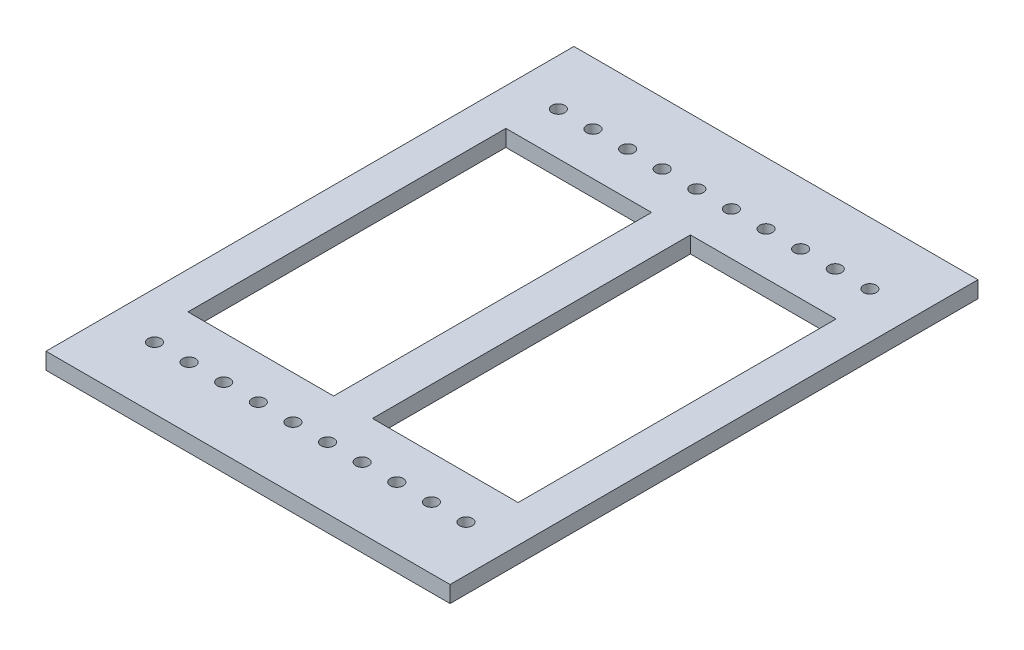
ISO-10303-21;
HEADER;
FILE_DESCRIPTION(('STEP AP214'),'2;1');
FILE_NAME('part.step','',(''),(''),'','','');
FILE_SCHEMA(('AUTOMOTIVE_DESIGN { 1 0 10303 214 1 1 1 1 }'));
ENDSEC;
DATA;
#1=APPLICATION_CONTEXT('core data for automotive mechanical design processes');
#2=APPLICATION_PROTOCOL_DEFINITION('international standard','automotive_design',2000,#1);
#3=PRODUCT_CONTEXT('',#1,'mechanical');
#4=PRODUCT('Part','Part','',(#3));
#5=PRODUCT_RELATED_PRODUCT_CATEGORY('part','',(#4));
#6=PRODUCT_DEFINITION_FORMATION('','',#4);
#7=PRODUCT_DEFINITION_CONTEXT('part definition',#1,'design');
#8=PRODUCT_DEFINITION('design','',#6,#7);
#9=PRODUCT_DEFINITION_SHAPE('','',#8);
#10=(LENGTH_UNIT() NAMED_UNIT(*) SI_UNIT(.MILLI.,.METRE.));
#11=(NAMED_UNIT(*) PLANE_ANGLE_UNIT() SI_UNIT($,.RADIAN.));
#12=(NAMED_UNIT(*) SI_UNIT($,.STERADIAN.) SOLID_ANGLE_UNIT());
#13=UNCERTAINTY_MEASURE_WITH_UNIT(LENGTH_MEASURE(1.E-05),#10,'distance_accuracy_value','');
#14=(GEOMETRIC_REPRESENTATION_CONTEXT(3) GLOBAL_UNCERTAINTY_ASSIGNED_CONTEXT((#13)) GLOBAL_UNIT_ASSIGNED_CONTEXT((#10,
#11,#12)) REPRESENTATION_CONTEXT('',''));
#15=CARTESIAN_POINT('',(0.,0.,0.));
#16=DIRECTION('',(0.,0.,1.));
#17=DIRECTION('',(1.,0.,0.));
#18=AXIS2_PLACEMENT_3D('',#15,#16,#17);
#19=CARTESIAN_POINT('',(0.,0.85,0.));
#20=DIRECTION('',(0.,-1.,0.));
#21=DIRECTION('',(0.,0.,-1.));
#22=AXIS2_PLACEMENT_3D('',#19,#20,#21);
#23=PLANE('',#22);
#24=DIRECTION('',(0.,0.,1.));
#25=VECTOR('',#24,1.);
#26=CARTESIAN_POINT('',(1.9,0.85,-21.75));
#27=LINE('',#26,#25);
#28=CARTESIAN_POINT('',(1.9,0.85,-21.75));
#29=VERTEX_POINT('',#28);
#30=CARTESIAN_POINT('',(1.9,0.85,-5.4));
#31=VERTEX_POINT('',#30);
#32=EDGE_CURVE('E167',#29,#31,#27,.T.);
#33=ORIENTED_EDGE('',*,*,#32,.F.);
#34=DIRECTION('',(-1.,0.,0.));
#35=VECTOR('',#34,1.);
#36=CARTESIAN_POINT('',(1.9,0.85,-21.75));
#37=LINE('',#36,#35);
#38=CARTESIAN_POINT('',(9.39,0.85,-21.75));
#39=VERTEX_POINT('',#38);
#40=EDGE_CURVE('E175',#39,#29,#37,.T.);
#41=ORIENTED_EDGE('',*,*,#40,.F.);
#42=DIRECTION('',(0.,0.,-1.));
#43=VECTOR('',#42,1.);
#44=CARTESIAN_POINT('',(9.39,0.85,-21.75));
#45=LINE('',#44,#43);
#46=CARTESIAN_POINT('',(9.39,0.85,-5.4));
#47=VERTEX_POINT('',#46);
#48=EDGE_CURVE('E172',#47,#39,#45,.T.);
#49=ORIENTED_EDGE('',*,*,#48,.F.);
#50=DIRECTION('',(1.,0.,0.));
#51=VECTOR('',#50,1.);
#52=CARTESIAN_POINT('',(1.9,0.85,-5.4));
#53=LINE('',#52,#51);
#54=EDGE_CURVE('E169',#31,#47,#53,.T.);
#55=ORIENTED_EDGE('',*,*,#54,.F.);
#56=EDGE_LOOP('',(#33,#41,#49,#55));
#57=FACE_BOUND('',#56,.T.);
#58=DIRECTION('',(0.,0.,1.));
#59=VECTOR('',#58,1.);
#60=CARTESIAN_POINT('',(0.,0.85,0.));
#61=LINE('',#60,#59);
#62=CARTESIAN_POINT('',(0.,0.85,-27.15));
#63=VERTEX_POINT('',#62);
#64=CARTESIAN_POINT('',(0.,0.85,0.));
#65=VERTEX_POINT('',#64);
#66=EDGE_CURVE('E198',#63,#65,#61,.T.);
#67=ORIENTED_EDGE('',*,*,#66,.T.);
#68=DIRECTION('',(1.,0.,0.));
#69=VECTOR('',#68,1.);
#70=CARTESIAN_POINT('',(0.,0.85,0.));
#71=LINE('',#70,#69);
#72=CARTESIAN_POINT('',(20.78,0.85,0.));
#73=VERTEX_POINT('',#72);
#74=EDGE_CURVE('E201',#65,#73,#71,.T.);
#75=ORIENTED_EDGE('',*,*,#74,.T.);
#76=DIRECTION('',(0.,0.,-1.));
#77=VECTOR('',#76,1.);
#78=CARTESIAN_POINT('',(20.78,0.85,0.));
#79=LINE('',#78,#77);
#80=CARTESIAN_POINT('',(20.78,0.85,-27.15));
#81=VERTEX_POINT('',#80);
#82=EDGE_CURVE('E204',#73,#81,#79,.T.);
#83=ORIENTED_EDGE('',*,*,#82,.T.);
#84=DIRECTION('',(-1.,0.,0.));
#85=VECTOR('',#84,1.);
#86=CARTESIAN_POINT('',(0.,0.85,-27.15));
#87=LINE('',#86,#85);
#88=EDGE_CURVE('E206',#81,#63,#87,.T.);
#89=ORIENTED_EDGE('',*,*,#88,.T.);
#90=EDGE_LOOP('',(#67,#75,#83,#89));
#91=FACE_BOUND('',#90,.T.);
#92=DIRECTION('',(0.,0.,-1.));
#93=VECTOR('',#92,1.);
#94=CARTESIAN_POINT('',(18.88,0.85,-21.75));
#95=LINE('',#94,#93);
#96=CARTESIAN_POINT('',(18.88,0.85,-5.40000000000001));
#97=VERTEX_POINT('',#96);
#98=CARTESIAN_POINT('',(18.88,0.85,-21.75));
#99=VERTEX_POINT('',#98);
#100=EDGE_CURVE('E128',#97,#99,#95,.T.);
#101=ORIENTED_EDGE('',*,*,#100,.F.);
#102=DIRECTION('',(1.,0.,0.));
#103=VECTOR('',#102,1.);
#104=CARTESIAN_POINT('',(18.88,0.85,-5.40000000000001));
#105=LINE('',#104,#103);
#106=CARTESIAN_POINT('',(11.39,0.85,-5.40000000000001));
#107=VERTEX_POINT('',#106);
#108=EDGE_CURVE('E151',#107,#97,#105,.T.);
#109=ORIENTED_EDGE('',*,*,#108,.F.);
#110=DIRECTION('',(0.,0.,1.));
#111=VECTOR('',#110,1.);
#112=CARTESIAN_POINT('',(11.39,0.85,-21.75));
#113=LINE('',#112,#111);
#114=CARTESIAN_POINT('',(11.39,0.85,-21.75));
#115=VERTEX_POINT('',#114);
#116=EDGE_CURVE('E149',#115,#107,#113,.T.);
#117=ORIENTED_EDGE('',*,*,#116,.F.);
#118=DIRECTION('',(-1.,0.,0.));
#119=VECTOR('',#118,1.);
#120=CARTESIAN_POINT('',(18.88,0.85,-21.75));
#121=LINE('',#120,#119);
#122=EDGE_CURVE('E136',#99,#115,#121,.T.);
#123=ORIENTED_EDGE('',*,*,#122,.F.);
#124=EDGE_LOOP('',(#101,#109,#117,#123));
#125=FACE_BOUND('',#124,.T.);
#126=CARTESIAN_POINT('',(2.389,0.85,-23.96));
#127=DIRECTION('',(0.,1.,0.));
#128=DIRECTION('',(0.,0.,1.));
#129=AXIS2_PLACEMENT_3D('',#126,#127,#128);
#130=CIRCLE('',#129,0.33);
#131=CARTESIAN_POINT('',(2.389,0.85,-23.63));
#132=VERTEX_POINT('',#131);
#133=EDGE_CURVE('E157',#132,#132,#130,.T.);
#134=ORIENTED_EDGE('',*,*,#133,.F.);
#135=EDGE_LOOP('',(#134));
#136=FACE_BOUND('',#135,.T.);
#137=CARTESIAN_POINT('',(18.409,0.85,-3.19));
#138=DIRECTION('',(0.,1.,0.));
#139=DIRECTION('',(0.,0.,-1.));
#140=AXIS2_PLACEMENT_3D('',#137,#138,#139);
#141=CIRCLE('',#140,0.330000000000007);
#142=CARTESIAN_POINT('',(18.409,0.85,-3.52));
#143=VERTEX_POINT('',#142);
#144=EDGE_CURVE('E497',#143,#143,#141,.T.);
#145=ORIENTED_EDGE('',*,*,#144,.F.);
#146=EDGE_LOOP('',(#145));
#147=FACE_BOUND('',#146,.T.);
#148=CARTESIAN_POINT('',(4.169,0.85,-23.96));
#149=DIRECTION('',(0.,1.,0.));
#150=DIRECTION('',(0.,0.,1.));
#151=AXIS2_PLACEMENT_3D('',#148,#149,#150);
#152=CIRCLE('',#151,0.33);
#153=CARTESIAN_POINT('',(4.169,0.85,-23.63));
#154=VERTEX_POINT('',#153);
#155=EDGE_CURVE('E491',#154,#154,#152,.T.);
#156=ORIENTED_EDGE('',*,*,#155,.F.);
#157=EDGE_LOOP('',(#156));
#158=FACE_BOUND('',#157,.T.);
#159=CARTESIAN_POINT('',(5.949,0.85,-23.96));
#160=DIRECTION('',(0.,1.,0.));
#161=DIRECTION('',(0.,0.,1.));
#162=AXIS2_PLACEMENT_3D('',#159,#160,#161);
#163=CIRCLE('',#162,0.33);
#164=CARTESIAN_POINT('',(5.949,0.85,-23.63));
#165=VERTEX_POINT('',#164);
#166=EDGE_CURVE('E485',#165,#165,#163,.T.);
#167=ORIENTED_EDGE('',*,*,#166,.F.);
#168=EDGE_LOOP('',(#167));
#169=FACE_BOUND('',#168,.T.);
#170=CARTESIAN_POINT('',(7.729,0.85,-23.96));
#171=DIRECTION('',(0.,1.,0.));
#172=DIRECTION('',(0.,0.,1.));
#173=AXIS2_PLACEMENT_3D('',#170,#171,#172);
#174=CIRCLE('',#173,0.33);
#175=CARTESIAN_POINT('',(7.729,0.85,-23.63));
#176=VERTEX_POINT('',#175);
#177=EDGE_CURVE('E479',#176,#176,#174,.T.);
#178=ORIENTED_EDGE('',*,*,#177,.F.);
#179=EDGE_LOOP('',(#178));
#180=FACE_BOUND('',#179,.T.);
#181=CARTESIAN_POINT('',(9.509,0.85,-23.96));
#182=DIRECTION('',(0.,1.,0.));
#183=DIRECTION('',(0.,0.,1.));
#184=AXIS2_PLACEMENT_3D('',#181,#182,#183);
#185=CIRCLE('',#184,0.33);
#186=CARTESIAN_POINT('',(9.509,0.85,-23.63));
#187=VERTEX_POINT('',#186);
#188=EDGE_CURVE('E473',#187,#187,#185,.T.);
#189=ORIENTED_EDGE('',*,*,#188,.F.);
#190=EDGE_LOOP('',(#189));
#191=FACE_BOUND('',#190,.T.);
#192=CARTESIAN_POINT('',(11.289,0.85,-23.96));
#193=DIRECTION('',(0.,1.,0.));
#194=DIRECTION('',(0.,0.,1.));
#195=AXIS2_PLACEMENT_3D('',#192,#193,#194);
#196=CIRCLE('',#195,0.329999999999999);
#197=CARTESIAN_POINT('',(11.289,0.85,-23.63));
#198=VERTEX_POINT('',#197);
#199=EDGE_CURVE('E467',#198,#198,#196,.T.);
#200=ORIENTED_EDGE('',*,*,#199,.F.);
#201=EDGE_LOOP('',(#200));
#202=FACE_BOUND('',#201,.T.);
#203=CARTESIAN_POINT('',(13.069,0.85,-23.96));
#204=DIRECTION('',(0.,1.,0.));
#205=DIRECTION('',(0.,0.,1.));
#206=AXIS2_PLACEMENT_3D('',#203,#204,#205);
#207=CIRCLE('',#206,0.329999999999999);
#208=CARTESIAN_POINT('',(13.069,0.85,-23.63));
#209=VERTEX_POINT('',#208);
#210=EDGE_CURVE('E461',#209,#209,#207,.T.);
#211=ORIENTED_EDGE('',*,*,#210,.F.);
#212=EDGE_LOOP('',(#211));
#213=FACE_BOUND('',#212,.T.);
#214=CARTESIAN_POINT('',(14.849,0.85,-23.96));
#215=DIRECTION('',(0.,1.,0.));
#216=DIRECTION('',(0.,0.,1.));
#217=AXIS2_PLACEMENT_3D('',#214,#215,#216);
#218=CIRCLE('',#217,0.329999999999999);
#219=CARTESIAN_POINT('',(14.849,0.85,-23.63));
#220=VERTEX_POINT('',#219);
#221=EDGE_CURVE('E455',#220,#220,#218,.T.);
#222=ORIENTED_EDGE('',*,*,#221,.F.);
#223=EDGE_LOOP('',(#222));
#224=FACE_BOUND('',#223,.T.);
#225=CARTESIAN_POINT('',(16.629,0.85,-23.96));
#226=DIRECTION('',(0.,1.,0.));
#227=DIRECTION('',(0.,0.,1.));
#228=AXIS2_PLACEMENT_3D('',#225,#226,#227);
#229=CIRCLE('',#228,0.33);
#230=CARTESIAN_POINT('',(16.629,0.85,-23.63));
#231=VERTEX_POINT('',#230);
#232=EDGE_CURVE('E449',#231,#231,#229,.T.);
#233=ORIENTED_EDGE('',*,*,#232,.F.);
#234=EDGE_LOOP('',(#233));
#235=FACE_BOUND('',#234,.T.);
#236=CARTESIAN_POINT('',(18.409,0.85,-23.96));
#237=DIRECTION('',(0.,1.,0.));
#238=DIRECTION('',(0.,0.,1.));
#239=AXIS2_PLACEMENT_3D('',#236,#237,#238);
#240=CIRCLE('',#239,0.33);
#241=CARTESIAN_POINT('',(18.409,0.85,-23.63));
#242=VERTEX_POINT('',#241);
#243=EDGE_CURVE('E443',#242,#242,#240,.T.);
#244=ORIENTED_EDGE('',*,*,#243,.F.);
#245=EDGE_LOOP('',(#244));
#246=FACE_BOUND('',#245,.T.);
#247=CARTESIAN_POINT('',(16.629,0.85,-3.19));
#248=DIRECTION('',(0.,1.,0.));
#249=DIRECTION('',(0.,0.,-1.));
#250=AXIS2_PLACEMENT_3D('',#247,#248,#249);
#251=CIRCLE('',#250,0.330000000000007);
#252=CARTESIAN_POINT('',(16.629,0.85,-3.52));
#253=VERTEX_POINT('',#252);
#254=EDGE_CURVE('E437',#253,#253,#251,.T.);
#255=ORIENTED_EDGE('',*,*,#254,.F.);
#256=EDGE_LOOP('',(#255));
#257=FACE_BOUND('',#256,.T.);
#258=CARTESIAN_POINT('',(14.849,0.85,-3.18999999999999));
#259=DIRECTION('',(0.,1.,0.));
#260=DIRECTION('',(0.,0.,-1.));
#261=AXIS2_PLACEMENT_3D('',#258,#259,#260);
#262=CIRCLE('',#261,0.329999999999999);
#263=CARTESIAN_POINT('',(14.849,0.85,-3.51999999999999));
#264=VERTEX_POINT('',#263);
#265=EDGE_CURVE('E431',#264,#264,#262,.T.);
#266=ORIENTED_EDGE('',*,*,#265,.F.);
#267=EDGE_LOOP('',(#266));
#268=FACE_BOUND('',#267,.T.);
#269=CARTESIAN_POINT('',(13.069,0.85,-3.18999999999999));
#270=DIRECTION('',(0.,1.,0.));
#271=DIRECTION('',(0.,0.,-1.));
#272=AXIS2_PLACEMENT_3D('',#269,#270,#271);
#273=CIRCLE('',#272,0.329999999999999);
#274=CARTESIAN_POINT('',(13.069,0.85,-3.51999999999999));
#275=VERTEX_POINT('',#274);
#276=EDGE_CURVE('E425',#275,#275,#273,.T.);
#277=ORIENTED_EDGE('',*,*,#276,.F.);
#278=EDGE_LOOP('',(#277));
#279=FACE_BOUND('',#278,.T.);
#280=CARTESIAN_POINT('',(11.289,0.85,-3.18999999999999));
#281=DIRECTION('',(0.,1.,0.));
#282=DIRECTION('',(0.,0.,-1.));
#283=AXIS2_PLACEMENT_3D('',#280,#281,#282);
#284=CIRCLE('',#283,0.329999999999999);
#285=CARTESIAN_POINT('',(11.289,0.85,-3.51999999999999));
#286=VERTEX_POINT('',#285);
#287=EDGE_CURVE('E419',#286,#286,#284,.T.);
#288=ORIENTED_EDGE('',*,*,#287,.F.);
#289=EDGE_LOOP('',(#288));
#290=FACE_BOUND('',#289,.T.);
#291=CARTESIAN_POINT('',(9.509,0.85,-3.18999999999999));
#292=DIRECTION('',(0.,1.,0.));
#293=DIRECTION('',(0.,0.,-1.));
#294=AXIS2_PLACEMENT_3D('',#291,#292,#293);
#295=CIRCLE('',#294,0.33);
#296=CARTESIAN_POINT('',(9.509,0.85,-3.51999999999999));
#297=VERTEX_POINT('',#296);
#298=EDGE_CURVE('E413',#297,#297,#295,.T.);
#299=ORIENTED_EDGE('',*,*,#298,.F.);
#300=EDGE_LOOP('',(#299));
#301=FACE_BOUND('',#300,.T.);
#302=CARTESIAN_POINT('',(7.729,0.85,-3.18999999999999));
#303=DIRECTION('',(0.,1.,0.));
#304=DIRECTION('',(0.,0.,-1.));
#305=AXIS2_PLACEMENT_3D('',#302,#303,#304);
#306=CIRCLE('',#305,0.33);
#307=CARTESIAN_POINT('',(7.729,0.85,-3.51999999999999));
#308=VERTEX_POINT('',#307);
#309=EDGE_CURVE('E407',#308,#308,#306,.T.);
#310=ORIENTED_EDGE('',*,*,#309,.F.);
#311=EDGE_LOOP('',(#310));
#312=FACE_BOUND('',#311,.T.);
#313=CARTESIAN_POINT('',(5.949,0.85,-3.18999999999999));
#314=DIRECTION('',(0.,1.,0.));
#315=DIRECTION('',(0.,0.,-1.));
#316=AXIS2_PLACEMENT_3D('',#313,#314,#315);
#317=CIRCLE('',#316,0.33);
#318=CARTESIAN_POINT('',(5.949,0.85,-3.51999999999999));
#319=VERTEX_POINT('',#318);
#320=EDGE_CURVE('E401',#319,#319,#317,.T.);
#321=ORIENTED_EDGE('',*,*,#320,.F.);
#322=EDGE_LOOP('',(#321));
#323=FACE_BOUND('',#322,.T.);
#324=CARTESIAN_POINT('',(4.169,0.85,-3.18999999999999));
#325=DIRECTION('',(0.,1.,0.));
#326=DIRECTION('',(0.,0.,-1.));
#327=AXIS2_PLACEMENT_3D('',#324,#325,#326);
#328=CIRCLE('',#327,0.33);
#329=CARTESIAN_POINT('',(4.169,0.85,-3.51999999999999));
#330=VERTEX_POINT('',#329);
#331=EDGE_CURVE('E395',#330,#330,#328,.T.);
#332=ORIENTED_EDGE('',*,*,#331,.F.);
#333=EDGE_LOOP('',(#332));
#334=FACE_BOUND('',#333,.T.);
#335=CARTESIAN_POINT('',(2.389,0.85,-3.18999999999999));
#336=DIRECTION('',(0.,1.,0.));
#337=DIRECTION('',(0.,0.,-1.));
#338=AXIS2_PLACEMENT_3D('',#335,#336,#337);
#339=CIRCLE('',#338,0.33);
#340=CARTESIAN_POINT('',(2.389,0.85,-3.51999999999999));
#341=VERTEX_POINT('',#340);
#342=EDGE_CURVE('E386',#341,#341,#339,.T.);
#343=ORIENTED_EDGE('',*,*,#342,.F.);
#344=EDGE_LOOP('',(#343));
#345=FACE_BOUND('',#344,.T.);
#346=ADVANCED_FACE('F39',(#57,#91,#125,#136,#147,#158,#169,#180,#191,#202,#213,#224,#235,#246,
#257,#268,#279,#290,#301,#312,#323,#334,#345),#23,.F.);
#347=CARTESIAN_POINT('',(0.,0.,0.));
#348=DIRECTION('',(0.,-1.,0.));
#349=DIRECTION('',(0.,0.,-1.));
#350=AXIS2_PLACEMENT_3D('',#347,#348,#349);
#351=PLANE('',#350);
#352=CARTESIAN_POINT('',(4.169,0.,-3.18999999999999));
#353=DIRECTION('',(0.,1.,0.));
#354=DIRECTION('',(0.,0.,-1.));
#355=AXIS2_PLACEMENT_3D('',#352,#353,#354);
#356=CIRCLE('',#355,0.33);
#357=CARTESIAN_POINT('',(4.169,0.,-3.51999999999999));
#358=VERTEX_POINT('',#357);
#359=EDGE_CURVE('E392',#358,#358,#356,.T.);
#360=ORIENTED_EDGE('',*,*,#359,.T.);
#361=EDGE_LOOP('',(#360));
#362=FACE_BOUND('',#361,.T.);
#363=CARTESIAN_POINT('',(7.729,0.,-3.18999999999999));
#364=DIRECTION('',(0.,1.,0.));
#365=DIRECTION('',(0.,0.,-1.));
#366=AXIS2_PLACEMENT_3D('',#363,#364,#365);
#367=CIRCLE('',#366,0.33);
#368=CARTESIAN_POINT('',(7.729,0.,-3.51999999999999));
#369=VERTEX_POINT('',#368);
#370=EDGE_CURVE('E404',#369,#369,#367,.T.);
#371=ORIENTED_EDGE('',*,*,#370,.T.);
#372=EDGE_LOOP('',(#371));
#373=FACE_BOUND('',#372,.T.);
#374=CARTESIAN_POINT('',(11.289,0.,-3.18999999999999));
#375=DIRECTION('',(0.,1.,0.));
#376=DIRECTION('',(0.,0.,-1.));
#377=AXIS2_PLACEMENT_3D('',#374,#375,#376);
#378=CIRCLE('',#377,0.329999999999999);
#379=CARTESIAN_POINT('',(11.289,0.,-3.51999999999999));
#380=VERTEX_POINT('',#379);
#381=EDGE_CURVE('E416',#380,#380,#378,.T.);
#382=ORIENTED_EDGE('',*,*,#381,.T.);
#383=EDGE_LOOP('',(#382));
#384=FACE_BOUND('',#383,.T.);
#385=CARTESIAN_POINT('',(14.849,0.,-3.18999999999999));
#386=DIRECTION('',(0.,1.,0.));
#387=DIRECTION('',(0.,0.,-1.));
#388=AXIS2_PLACEMENT_3D('',#385,#386,#387);
#389=CIRCLE('',#388,0.329999999999999);
#390=CARTESIAN_POINT('',(14.849,0.,-3.51999999999999));
#391=VERTEX_POINT('',#390);
#392=EDGE_CURVE('E428',#391,#391,#389,.T.);
#393=ORIENTED_EDGE('',*,*,#392,.T.);
#394=EDGE_LOOP('',(#393));
#395=FACE_BOUND('',#394,.T.);
#396=CARTESIAN_POINT('',(18.409,0.,-23.96));
#397=DIRECTION('',(0.,1.,0.));
#398=DIRECTION('',(0.,0.,1.));
#399=AXIS2_PLACEMENT_3D('',#396,#397,#398);
#400=CIRCLE('',#399,0.33);
#401=CARTESIAN_POINT('',(18.409,0.,-23.63));
#402=VERTEX_POINT('',#401);
#403=EDGE_CURVE('E440',#402,#402,#400,.T.);
#404=ORIENTED_EDGE('',*,*,#403,.T.);
#405=EDGE_LOOP('',(#404));
#406=FACE_BOUND('',#405,.T.);
#407=CARTESIAN_POINT('',(14.849,0.,-23.96));
#408=DIRECTION('',(0.,1.,0.));
#409=DIRECTION('',(0.,0.,1.));
#410=AXIS2_PLACEMENT_3D('',#407,#408,#409);
#411=CIRCLE('',#410,0.329999999999999);
#412=CARTESIAN_POINT('',(14.849,0.,-23.63));
#413=VERTEX_POINT('',#412);
#414=EDGE_CURVE('E452',#413,#413,#411,.T.);
#415=ORIENTED_EDGE('',*,*,#414,.T.);
#416=EDGE_LOOP('',(#415));
#417=FACE_BOUND('',#416,.T.);
#418=CARTESIAN_POINT('',(11.289,0.,-23.96));
#419=DIRECTION('',(0.,1.,0.));
#420=DIRECTION('',(0.,0.,1.));
#421=AXIS2_PLACEMENT_3D('',#418,#419,#420);
#422=CIRCLE('',#421,0.329999999999999);
#423=CARTESIAN_POINT('',(11.289,0.,-23.63));
#424=VERTEX_POINT('',#423);
#425=EDGE_CURVE('E464',#424,#424,#422,.T.);
#426=ORIENTED_EDGE('',*,*,#425,.T.);
#427=EDGE_LOOP('',(#426));
#428=FACE_BOUND('',#427,.T.);
#429=CARTESIAN_POINT('',(7.729,0.,-23.96));
#430=DIRECTION('',(0.,1.,0.));
#431=DIRECTION('',(0.,0.,1.));
#432=AXIS2_PLACEMENT_3D('',#429,#430,#431);
#433=CIRCLE('',#432,0.33);
#434=CARTESIAN_POINT('',(7.729,0.,-23.63));
#435=VERTEX_POINT('',#434);
#436=EDGE_CURVE('E476',#435,#435,#433,.T.);
#437=ORIENTED_EDGE('',*,*,#436,.T.);
#438=EDGE_LOOP('',(#437));
#439=FACE_BOUND('',#438,.T.);
#440=CARTESIAN_POINT('',(4.169,0.,-23.96));
#441=DIRECTION('',(0.,1.,0.));
#442=DIRECTION('',(0.,0.,1.));
#443=AXIS2_PLACEMENT_3D('',#440,#441,#442);
#444=CIRCLE('',#443,0.33);
#445=CARTESIAN_POINT('',(4.169,0.,-23.63));
#446=VERTEX_POINT('',#445);
#447=EDGE_CURVE('E488',#446,#446,#444,.T.);
#448=ORIENTED_EDGE('',*,*,#447,.T.);
#449=EDGE_LOOP('',(#448));
#450=FACE_BOUND('',#449,.T.);
#451=CARTESIAN_POINT('',(2.389,0.,-23.96));
#452=DIRECTION('',(0.,1.,0.));
#453=DIRECTION('',(0.,0.,1.));
#454=AXIS2_PLACEMENT_3D('',#451,#452,#453);
#455=CIRCLE('',#454,0.33);
#456=CARTESIAN_POINT('',(2.389,0.,-23.63));
#457=VERTEX_POINT('',#456);
#458=EDGE_CURVE('E500',#457,#457,#455,.T.);
#459=ORIENTED_EDGE('',*,*,#458,.T.);
#460=EDGE_LOOP('',(#459));
#461=FACE_BOUND('',#460,.T.);
#462=DIRECTION('',(0.,0.,1.));
#463=VECTOR('',#462,1.);
#464=CARTESIAN_POINT('',(0.,0.,0.));
#465=LINE('',#464,#463);
#466=CARTESIAN_POINT('',(0.,0.,-27.15));
#467=VERTEX_POINT('',#466);
#468=CARTESIAN_POINT('',(0.,0.,0.));
#469=VERTEX_POINT('',#468);
#470=EDGE_CURVE('E197',#467,#469,#465,.T.);
#471=ORIENTED_EDGE('',*,*,#470,.F.);
#472=DIRECTION('',(-1.,0.,0.));
#473=VECTOR('',#472,1.);
#474=CARTESIAN_POINT('',(0.,0.,-27.15));
#475=LINE('',#474,#473);
#476=CARTESIAN_POINT('',(20.78,0.,-27.15));
#477=VERTEX_POINT('',#476);
#478=EDGE_CURVE('E202',#477,#467,#475,.T.);
#479=ORIENTED_EDGE('',*,*,#478,.F.);
#480=DIRECTION('',(0.,0.,-1.));
#481=VECTOR('',#480,1.);
#482=CARTESIAN_POINT('',(20.78,0.,0.));
#483=LINE('',#482,#481);
#484=CARTESIAN_POINT('',(20.78,0.,0.));
#485=VERTEX_POINT('',#484);
#486=EDGE_CURVE('E213',#485,#477,#483,.T.);
#487=ORIENTED_EDGE('',*,*,#486,.F.);
#488=DIRECTION('',(1.,0.,0.));
#489=VECTOR('',#488,1.);
#490=CARTESIAN_POINT('',(0.,0.,0.));
#491=LINE('',#490,#489);
#492=EDGE_CURVE('E211',#469,#485,#491,.T.);
#493=ORIENTED_EDGE('',*,*,#492,.F.);
#494=EDGE_LOOP('',(#471,#479,#487,#493));
#495=FACE_BOUND('',#494,.T.);
#496=DIRECTION('',(-1.,0.,0.));
#497=VECTOR('',#496,1.);
#498=CARTESIAN_POINT('',(1.9,0.,-21.75));
#499=LINE('',#498,#497);
#500=CARTESIAN_POINT('',(9.39,0.,-21.75));
#501=VERTEX_POINT('',#500);
#502=CARTESIAN_POINT('',(1.9,0.,-21.75));
#503=VERTEX_POINT('',#502);
#504=EDGE_CURVE('E170',#501,#503,#499,.T.);
#505=ORIENTED_EDGE('',*,*,#504,.T.);
#506=DIRECTION('',(0.,0.,1.));
#507=VECTOR('',#506,1.);
#508=CARTESIAN_POINT('',(1.9,0.,-21.75));
#509=LINE('',#508,#507);
#510=CARTESIAN_POINT('',(1.9,0.,-5.4));
#511=VERTEX_POINT('',#510);
#512=EDGE_CURVE('E144',#503,#511,#509,.T.);
#513=ORIENTED_EDGE('',*,*,#512,.T.);
#514=DIRECTION('',(1.,0.,0.));
#515=VECTOR('',#514,1.);
#516=CARTESIAN_POINT('',(1.9,0.,-5.4));
#517=LINE('',#516,#515);
#518=CARTESIAN_POINT('',(9.39,0.,-5.4));
#519=VERTEX_POINT('',#518);
#520=EDGE_CURVE('E180',#511,#519,#517,.T.);
#521=ORIENTED_EDGE('',*,*,#520,.T.);
#522=DIRECTION('',(0.,0.,-1.));
#523=VECTOR('',#522,1.);
#524=CARTESIAN_POINT('',(9.39,0.,-21.75));
#525=LINE('',#524,#523);
#526=EDGE_CURVE('E183',#519,#501,#525,.T.);
#527=ORIENTED_EDGE('',*,*,#526,.T.);
#528=EDGE_LOOP('',(#505,#513,#521,#527));
#529=FACE_BOUND('',#528,.T.);
#530=DIRECTION('',(1.,0.,0.));
#531=VECTOR('',#530,1.);
#532=CARTESIAN_POINT('',(18.88,0.,-5.40000000000001));
#533=LINE('',#532,#531);
#534=CARTESIAN_POINT('',(11.39,0.,-5.40000000000001));
#535=VERTEX_POINT('',#534);
#536=CARTESIAN_POINT('',(18.88,0.,-5.40000000000001));
#537=VERTEX_POINT('',#536);
#538=EDGE_CURVE('E137',#535,#537,#533,.T.);
#539=ORIENTED_EDGE('',*,*,#538,.T.);
#540=DIRECTION('',(0.,0.,-1.));
#541=VECTOR('',#540,1.);
#542=CARTESIAN_POINT('',(18.88,0.,-21.75));
#543=LINE('',#542,#541);
#544=CARTESIAN_POINT('',(18.88,0.,-21.75));
#545=VERTEX_POINT('',#544);
#546=EDGE_CURVE('E62',#537,#545,#543,.T.);
#547=ORIENTED_EDGE('',*,*,#546,.T.);
#548=DIRECTION('',(-1.,0.,0.));
#549=VECTOR('',#548,1.);
#550=CARTESIAN_POINT('',(18.88,0.,-21.75));
#551=LINE('',#550,#549);
#552=CARTESIAN_POINT('',(11.39,0.,-21.75));
#553=VERTEX_POINT('',#552);
#554=EDGE_CURVE('E143',#545,#553,#551,.T.);
#555=ORIENTED_EDGE('',*,*,#554,.T.);
#556=DIRECTION('',(0.,0.,1.));
#557=VECTOR('',#556,1.);
#558=CARTESIAN_POINT('',(11.39,0.,-21.75));
#559=LINE('',#558,#557);
#560=EDGE_CURVE('E159',#553,#535,#559,.T.);
#561=ORIENTED_EDGE('',*,*,#560,.T.);
#562=EDGE_LOOP('',(#539,#547,#555,#561));
#563=FACE_BOUND('',#562,.T.);
#564=CARTESIAN_POINT('',(18.409,0.,-3.19));
#565=DIRECTION('',(0.,1.,0.));
#566=DIRECTION('',(0.,0.,-1.));
#567=AXIS2_PLACEMENT_3D('',#564,#565,#566);
#568=CIRCLE('',#567,0.330000000000007);
#569=CARTESIAN_POINT('',(18.409,0.,-3.52));
#570=VERTEX_POINT('',#569);
#571=EDGE_CURVE('E494',#570,#570,#568,.T.);
#572=ORIENTED_EDGE('',*,*,#571,.T.);
#573=EDGE_LOOP('',(#572));
#574=FACE_BOUND('',#573,.T.);
#575=CARTESIAN_POINT('',(5.949,0.,-23.96));
#576=DIRECTION('',(0.,1.,0.));
#577=DIRECTION('',(0.,0.,1.));
#578=AXIS2_PLACEMENT_3D('',#575,#576,#577);
#579=CIRCLE('',#578,0.33);
#580=CARTESIAN_POINT('',(5.949,0.,-23.63));
#581=VERTEX_POINT('',#580);
#582=EDGE_CURVE('E482',#581,#581,#579,.T.);
#583=ORIENTED_EDGE('',*,*,#582,.T.);
#584=EDGE_LOOP('',(#583));
#585=FACE_BOUND('',#584,.T.);
#586=CARTESIAN_POINT('',(9.509,0.,-23.96));
#587=DIRECTION('',(0.,1.,0.));
#588=DIRECTION('',(0.,0.,1.));
#589=AXIS2_PLACEMENT_3D('',#586,#587,#588);
#590=CIRCLE('',#589,0.33);
#591=CARTESIAN_POINT('',(9.509,0.,-23.63));
#592=VERTEX_POINT('',#591);
#593=EDGE_CURVE('E470',#592,#592,#590,.T.);
#594=ORIENTED_EDGE('',*,*,#593,.T.);
#595=EDGE_LOOP('',(#594));
#596=FACE_BOUND('',#595,.T.);
#597=CARTESIAN_POINT('',(13.069,0.,-23.96));
#598=DIRECTION('',(0.,1.,0.));
#599=DIRECTION('',(0.,0.,1.));
#600=AXIS2_PLACEMENT_3D('',#597,#598,#599);
#601=CIRCLE('',#600,0.329999999999999);
#602=CARTESIAN_POINT('',(13.069,0.,-23.63));
#603=VERTEX_POINT('',#602);
#604=EDGE_CURVE('E458',#603,#603,#601,.T.);
#605=ORIENTED_EDGE('',*,*,#604,.T.);
#606=EDGE_LOOP('',(#605));
#607=FACE_BOUND('',#606,.T.);
#608=CARTESIAN_POINT('',(16.629,0.,-23.96));
#609=DIRECTION('',(0.,1.,0.));
#610=DIRECTION('',(0.,0.,1.));
#611=AXIS2_PLACEMENT_3D('',#608,#609,#610);
#612=CIRCLE('',#611,0.33);
#613=CARTESIAN_POINT('',(16.629,0.,-23.63));
#614=VERTEX_POINT('',#613);
#615=EDGE_CURVE('E446',#614,#614,#612,.T.);
#616=ORIENTED_EDGE('',*,*,#615,.T.);
#617=EDGE_LOOP('',(#616));
#618=FACE_BOUND('',#617,.T.);
#619=CARTESIAN_POINT('',(16.629,0.,-3.19));
#620=DIRECTION('',(0.,1.,0.));
#621=DIRECTION('',(0.,0.,-1.));
#622=AXIS2_PLACEMENT_3D('',#619,#620,#621);
#623=CIRCLE('',#622,0.330000000000007);
#624=CARTESIAN_POINT('',(16.629,0.,-3.52));
#625=VERTEX_POINT('',#624);
#626=EDGE_CURVE('E434',#625,#625,#623,.T.);
#627=ORIENTED_EDGE('',*,*,#626,.T.);
#628=EDGE_LOOP('',(#627));
#629=FACE_BOUND('',#628,.T.);
#630=CARTESIAN_POINT('',(13.069,0.,-3.18999999999999));
#631=DIRECTION('',(0.,1.,0.));
#632=DIRECTION('',(0.,0.,-1.));
#633=AXIS2_PLACEMENT_3D('',#630,#631,#632);
#634=CIRCLE('',#633,0.329999999999999);
#635=CARTESIAN_POINT('',(13.069,0.,-3.51999999999999));
#636=VERTEX_POINT('',#635);
#637=EDGE_CURVE('E422',#636,#636,#634,.T.);
#638=ORIENTED_EDGE('',*,*,#637,.T.);
#639=EDGE_LOOP('',(#638));
#640=FACE_BOUND('',#639,.T.);
#641=CARTESIAN_POINT('',(9.509,0.,-3.18999999999999));
#642=DIRECTION('',(0.,1.,0.));
#643=DIRECTION('',(0.,0.,-1.));
#644=AXIS2_PLACEMENT_3D('',#641,#642,#643);
#645=CIRCLE('',#644,0.33);
#646=CARTESIAN_POINT('',(9.509,0.,-3.51999999999999));
#647=VERTEX_POINT('',#646);
#648=EDGE_CURVE('E410',#647,#647,#645,.T.);
#649=ORIENTED_EDGE('',*,*,#648,.T.);
#650=EDGE_LOOP('',(#649));
#651=FACE_BOUND('',#650,.T.);
#652=CARTESIAN_POINT('',(5.949,0.,-3.18999999999999));
#653=DIRECTION('',(0.,1.,0.));
#654=DIRECTION('',(0.,0.,-1.));
#655=AXIS2_PLACEMENT_3D('',#652,#653,#654);
#656=CIRCLE('',#655,0.33);
#657=CARTESIAN_POINT('',(5.949,0.,-3.51999999999999));
#658=VERTEX_POINT('',#657);
#659=EDGE_CURVE('E398',#658,#658,#656,.T.);
#660=ORIENTED_EDGE('',*,*,#659,.T.);
#661=EDGE_LOOP('',(#660));
#662=FACE_BOUND('',#661,.T.);
#663=CARTESIAN_POINT('',(2.389,0.,-3.18999999999999));
#664=DIRECTION('',(0.,1.,0.));
#665=DIRECTION('',(0.,0.,-1.));
#666=AXIS2_PLACEMENT_3D('',#663,#664,#665);
#667=CIRCLE('',#666,0.33);
#668=CARTESIAN_POINT('',(2.389,0.,-3.51999999999999));
#669=VERTEX_POINT('',#668);
#670=EDGE_CURVE('E389',#669,#669,#667,.T.);
#671=ORIENTED_EDGE('',*,*,#670,.T.);
#672=EDGE_LOOP('',(#671));
#673=FACE_BOUND('',#672,.T.);
#674=ADVANCED_FACE('F231',(#362,#373,#384,#395,#406,#417,#428,#439,#450,#461,#495,#529,#563,
#574,#585,#596,#607,#618,#629,#640,#651,#662,#673),#351,.T.);
#675=CARTESIAN_POINT('',(0.,0.85,0.));
#676=DIRECTION('',(1.,0.,0.));
#677=DIRECTION('',(0.,0.,-1.));
#678=AXIS2_PLACEMENT_3D('',#675,#676,#677);
#679=PLANE('',#678);
#680=ORIENTED_EDGE('',*,*,#470,.T.);
#681=DIRECTION('',(0.,-1.,0.));
#682=VECTOR('',#681,1.);
#683=CARTESIAN_POINT('',(0.,0.85,0.));
#684=LINE('',#683,#682);
#685=EDGE_CURVE('E11',#65,#469,#684,.T.);
#686=ORIENTED_EDGE('',*,*,#685,.F.);
#687=ORIENTED_EDGE('',*,*,#66,.F.);
#688=DIRECTION('',(0.,-1.,0.));
#689=VECTOR('',#688,1.);
#690=CARTESIAN_POINT('',(0.,0.85,-27.15));
#691=LINE('',#690,#689);
#692=EDGE_CURVE('E208',#63,#467,#691,.T.);
#693=ORIENTED_EDGE('',*,*,#692,.T.);
#694=EDGE_LOOP('',(#680,#686,#687,#693));
#695=FACE_BOUND('',#694,.T.);
#696=ADVANCED_FACE('F41',(#695),#679,.F.);
#697=CARTESIAN_POINT('',(0.,0.85,0.));
#698=DIRECTION('',(0.,0.,-1.));
#699=DIRECTION('',(-1.,0.,0.));
#700=AXIS2_PLACEMENT_3D('',#697,#698,#699);
#701=PLANE('',#700);
#702=ORIENTED_EDGE('',*,*,#492,.T.);
#703=DIRECTION('',(0.,-1.,0.));
#704=VECTOR('',#703,1.);
#705=CARTESIAN_POINT('',(20.78,0.85,0.));
#706=LINE('',#705,#704);
#707=EDGE_CURVE('E47',#73,#485,#706,.T.);
#708=ORIENTED_EDGE('',*,*,#707,.F.);
#709=ORIENTED_EDGE('',*,*,#74,.F.);
#710=ORIENTED_EDGE('',*,*,#685,.T.);
#711=EDGE_LOOP('',(#702,#708,#709,#710));
#712=FACE_BOUND('',#711,.T.);
#713=ADVANCED_FACE('F241',(#712),#701,.F.);
#714=CARTESIAN_POINT('',(20.78,0.85,0.));
#715=DIRECTION('',(-1.,0.,0.));
#716=DIRECTION('',(0.,0.,1.));
#717=AXIS2_PLACEMENT_3D('',#714,#715,#716);
#718=PLANE('',#717);
#719=ORIENTED_EDGE('',*,*,#486,.T.);
#720=DIRECTION('',(0.,-1.,0.));
#721=VECTOR('',#720,1.);
#722=CARTESIAN_POINT('',(20.78,0.85,-27.15));
#723=LINE('',#722,#721);
#724=EDGE_CURVE('E218',#81,#477,#723,.T.);
#725=ORIENTED_EDGE('',*,*,#724,.F.);
#726=ORIENTED_EDGE('',*,*,#82,.F.);
#727=ORIENTED_EDGE('',*,*,#707,.T.);
#728=EDGE_LOOP('',(#719,#725,#726,#727));
#729=FACE_BOUND('',#728,.T.);
#730=ADVANCED_FACE('F225',(#729),#718,.F.);
#731=CARTESIAN_POINT('',(0.,0.85,-27.15));
#732=DIRECTION('',(0.,0.,1.));
#733=DIRECTION('',(1.,0.,0.));
#734=AXIS2_PLACEMENT_3D('',#731,#732,#733);
#735=PLANE('',#734);
#736=ORIENTED_EDGE('',*,*,#478,.T.);
#737=ORIENTED_EDGE('',*,*,#692,.F.);
#738=ORIENTED_EDGE('',*,*,#88,.F.);
#739=ORIENTED_EDGE('',*,*,#724,.T.);
#740=EDGE_LOOP('',(#736,#737,#738,#739));
#741=FACE_BOUND('',#740,.T.);
#742=ADVANCED_FACE('F235',(#741),#735,.F.);
#743=CARTESIAN_POINT('',(1.9,0.85,-21.75));
#744=DIRECTION('',(1.,0.,0.));
#745=DIRECTION('',(0.,0.,-1.));
#746=AXIS2_PLACEMENT_3D('',#743,#744,#745);
#747=PLANE('',#746);
#748=ORIENTED_EDGE('',*,*,#512,.F.);
#749=DIRECTION('',(0.,-1.,0.));
#750=VECTOR('',#749,1.);
#751=CARTESIAN_POINT('',(1.9,0.85,-21.75));
#752=LINE('',#751,#750);
#753=EDGE_CURVE('E177',#29,#503,#752,.T.);
#754=ORIENTED_EDGE('',*,*,#753,.F.);
#755=ORIENTED_EDGE('',*,*,#32,.T.);
#756=DIRECTION('',(0.,-1.,0.));
#757=VECTOR('',#756,1.);
#758=CARTESIAN_POINT('',(1.9,0.85,-5.4));
#759=LINE('',#758,#757);
#760=EDGE_CURVE('E194',#31,#511,#759,.T.);
#761=ORIENTED_EDGE('',*,*,#760,.T.);
#762=EDGE_LOOP('',(#748,#754,#755,#761));
#763=FACE_BOUND('',#762,.T.);
#764=ADVANCED_FACE('F258',(#763),#747,.T.);
#765=CARTESIAN_POINT('',(1.9,0.85,-5.4));
#766=DIRECTION('',(0.,0.,-1.));
#767=DIRECTION('',(-1.,0.,0.));
#768=AXIS2_PLACEMENT_3D('',#765,#766,#767);
#769=PLANE('',#768);
#770=ORIENTED_EDGE('',*,*,#520,.F.);
#771=ORIENTED_EDGE('',*,*,#760,.F.);
#772=ORIENTED_EDGE('',*,*,#54,.T.);
#773=DIRECTION('',(0.,-1.,0.));
#774=VECTOR('',#773,1.);
#775=CARTESIAN_POINT('',(9.39,0.85,-5.4));
#776=LINE('',#775,#774);
#777=EDGE_CURVE('E192',#47,#519,#776,.T.);
#778=ORIENTED_EDGE('',*,*,#777,.T.);
#779=EDGE_LOOP('',(#770,#771,#772,#778));
#780=FACE_BOUND('',#779,.T.);
#781=ADVANCED_FACE('F265',(#780),#769,.T.);
#782=CARTESIAN_POINT('',(9.39,0.85,-21.75));
#783=DIRECTION('',(-1.,0.,0.));
#784=DIRECTION('',(0.,0.,1.));
#785=AXIS2_PLACEMENT_3D('',#782,#783,#784);
#786=PLANE('',#785);
#787=ORIENTED_EDGE('',*,*,#526,.F.);
#788=ORIENTED_EDGE('',*,*,#777,.F.);
#789=ORIENTED_EDGE('',*,*,#48,.T.);
#790=DIRECTION('',(0.,-1.,0.));
#791=VECTOR('',#790,1.);
#792=CARTESIAN_POINT('',(9.39,0.85,-21.75));
#793=LINE('',#792,#791);
#794=EDGE_CURVE('E190',#39,#501,#793,.T.);
#795=ORIENTED_EDGE('',*,*,#794,.T.);
#796=EDGE_LOOP('',(#787,#788,#789,#795));
#797=FACE_BOUND('',#796,.T.);
#798=ADVANCED_FACE('F270',(#797),#786,.T.);
#799=CARTESIAN_POINT('',(1.9,0.85,-21.75));
#800=DIRECTION('',(0.,0.,1.));
#801=DIRECTION('',(1.,0.,0.));
#802=AXIS2_PLACEMENT_3D('',#799,#800,#801);
#803=PLANE('',#802);
#804=ORIENTED_EDGE('',*,*,#504,.F.);
#805=ORIENTED_EDGE('',*,*,#794,.F.);
#806=ORIENTED_EDGE('',*,*,#40,.T.);
#807=ORIENTED_EDGE('',*,*,#753,.T.);
#808=EDGE_LOOP('',(#804,#805,#806,#807));
#809=FACE_BOUND('',#808,.T.);
#810=ADVANCED_FACE('F276',(#809),#803,.T.);
#811=CARTESIAN_POINT('',(18.88,0.85,-21.75));
#812=DIRECTION('',(-1.,0.,0.));
#813=DIRECTION('',(0.,0.,1.));
#814=AXIS2_PLACEMENT_3D('',#811,#812,#813);
#815=PLANE('',#814);
#816=ORIENTED_EDGE('',*,*,#546,.F.);
#817=DIRECTION('',(0.,-1.,0.));
#818=VECTOR('',#817,1.);
#819=CARTESIAN_POINT('',(18.88,0.85,-5.40000000000001));
#820=LINE('',#819,#818);
#821=EDGE_CURVE('E132',#97,#537,#820,.T.);
#822=ORIENTED_EDGE('',*,*,#821,.F.);
#823=ORIENTED_EDGE('',*,*,#100,.T.);
#824=DIRECTION('',(0.,-1.,0.));
#825=VECTOR('',#824,1.);
#826=CARTESIAN_POINT('',(18.88,0.85,-21.75));
#827=LINE('',#826,#825);
#828=EDGE_CURVE('E131',#99,#545,#827,.T.);
#829=ORIENTED_EDGE('',*,*,#828,.T.);
#830=EDGE_LOOP('',(#816,#822,#823,#829));
#831=FACE_BOUND('',#830,.T.);
#832=ADVANCED_FACE('F130',(#831),#815,.T.);
#833=CARTESIAN_POINT('',(18.88,0.85,-21.75));
#834=DIRECTION('',(0.,0.,1.));
#835=DIRECTION('',(1.,0.,0.));
#836=AXIS2_PLACEMENT_3D('',#833,#834,#835);
#837=PLANE('',#836);
#838=ORIENTED_EDGE('',*,*,#554,.F.);
#839=ORIENTED_EDGE('',*,*,#828,.F.);
#840=ORIENTED_EDGE('',*,*,#122,.T.);
#841=DIRECTION('',(0.,-1.,0.));
#842=VECTOR('',#841,1.);
#843=CARTESIAN_POINT('',(11.39,0.85,-21.75));
#844=LINE('',#843,#842);
#845=EDGE_CURVE('E145',#115,#553,#844,.T.);
#846=ORIENTED_EDGE('',*,*,#845,.T.);
#847=EDGE_LOOP('',(#838,#839,#840,#846));
#848=FACE_BOUND('',#847,.T.);
#849=ADVANCED_FACE('F140',(#848),#837,.T.);
#850=CARTESIAN_POINT('',(11.39,0.85,-21.75));
#851=DIRECTION('',(1.,0.,0.));
#852=DIRECTION('',(0.,0.,-1.));
#853=AXIS2_PLACEMENT_3D('',#850,#851,#852);
#854=PLANE('',#853);
#855=ORIENTED_EDGE('',*,*,#560,.F.);
#856=ORIENTED_EDGE('',*,*,#845,.F.);
#857=ORIENTED_EDGE('',*,*,#116,.T.);
#858=DIRECTION('',(0.,-1.,0.));
#859=VECTOR('',#858,1.);
#860=CARTESIAN_POINT('',(11.39,0.85,-5.40000000000001));
#861=LINE('',#860,#859);
#862=EDGE_CURVE('E54',#107,#535,#861,.T.);
#863=ORIENTED_EDGE('',*,*,#862,.T.);
#864=EDGE_LOOP('',(#855,#856,#857,#863));
#865=FACE_BOUND('',#864,.T.);
#866=ADVANCED_FACE('F295',(#865),#854,.T.);
#867=CARTESIAN_POINT('',(18.88,0.85,-5.40000000000001));
#868=DIRECTION('',(0.,0.,-1.));
#869=DIRECTION('',(-1.,0.,0.));
#870=AXIS2_PLACEMENT_3D('',#867,#868,#869);
#871=PLANE('',#870);
#872=ORIENTED_EDGE('',*,*,#538,.F.);
#873=ORIENTED_EDGE('',*,*,#862,.F.);
#874=ORIENTED_EDGE('',*,*,#108,.T.);
#875=ORIENTED_EDGE('',*,*,#821,.T.);
#876=EDGE_LOOP('',(#872,#873,#874,#875));
#877=FACE_BOUND('',#876,.T.);
#878=ADVANCED_FACE('F298',(#877),#871,.T.);
#879=CARTESIAN_POINT('',(2.389,0.85,-23.96));
#880=DIRECTION('',(0.,-1.,0.));
#881=DIRECTION('',(0.,0.,-1.));
#882=AXIS2_PLACEMENT_3D('',#879,#880,#881);
#883=CYLINDRICAL_SURFACE('',#882,0.33);
#884=ORIENTED_EDGE('',*,*,#133,.T.);
#885=EDGE_LOOP('',(#884));
#886=FACE_BOUND('',#885,.T.);
#887=ORIENTED_EDGE('',*,*,#458,.F.);
#888=EDGE_LOOP('',(#887));
#889=FACE_BOUND('',#888,.T.);
#890=ADVANCED_FACE('F302',(#886,#889),#883,.F.);
#891=CARTESIAN_POINT('',(18.409,0.85,-3.19));
#892=DIRECTION('',(0.,-1.,0.));
#893=DIRECTION('',(0.,0.,-1.));
#894=AXIS2_PLACEMENT_3D('',#891,#892,#893);
#895=CYLINDRICAL_SURFACE('',#894,0.330000000000007);
#896=ORIENTED_EDGE('',*,*,#144,.T.);
#897=EDGE_LOOP('',(#896));
#898=FACE_BOUND('',#897,.T.);
#899=ORIENTED_EDGE('',*,*,#571,.F.);
#900=EDGE_LOOP('',(#899));
#901=FACE_BOUND('',#900,.T.);
#902=ADVANCED_FACE('F305',(#898,#901),#895,.F.);
#903=CARTESIAN_POINT('',(4.169,0.85,-23.96));
#904=DIRECTION('',(0.,-1.,0.));
#905=DIRECTION('',(0.,0.,-1.));
#906=AXIS2_PLACEMENT_3D('',#903,#904,#905);
#907=CYLINDRICAL_SURFACE('',#906,0.33);
#908=ORIENTED_EDGE('',*,*,#155,.T.);
#909=EDGE_LOOP('',(#908));
#910=FACE_BOUND('',#909,.T.);
#911=ORIENTED_EDGE('',*,*,#447,.F.);
#912=EDGE_LOOP('',(#911));
#913=FACE_BOUND('',#912,.T.);
#914=ADVANCED_FACE('F309',(#910,#913),#907,.F.);
#915=CARTESIAN_POINT('',(5.949,0.85,-23.96));
#916=DIRECTION('',(0.,-1.,0.));
#917=DIRECTION('',(0.,0.,-1.));
#918=AXIS2_PLACEMENT_3D('',#915,#916,#917);
#919=CYLINDRICAL_SURFACE('',#918,0.33);
#920=ORIENTED_EDGE('',*,*,#166,.T.);
#921=EDGE_LOOP('',(#920));
#922=FACE_BOUND('',#921,.T.);
#923=ORIENTED_EDGE('',*,*,#582,.F.);
#924=EDGE_LOOP('',(#923));
#925=FACE_BOUND('',#924,.T.);
#926=ADVANCED_FACE('F313',(#922,#925),#919,.F.);
#927=CARTESIAN_POINT('',(7.729,0.85,-23.96));
#928=DIRECTION('',(0.,-1.,0.));
#929=DIRECTION('',(0.,0.,-1.));
#930=AXIS2_PLACEMENT_3D('',#927,#928,#929);
#931=CYLINDRICAL_SURFACE('',#930,0.33);
#932=ORIENTED_EDGE('',*,*,#177,.T.);
#933=EDGE_LOOP('',(#932));
#934=FACE_BOUND('',#933,.T.);
#935=ORIENTED_EDGE('',*,*,#436,.F.);
#936=EDGE_LOOP('',(#935));
#937=FACE_BOUND('',#936,.T.);
#938=ADVANCED_FACE('F317',(#934,#937),#931,.F.);
#939=CARTESIAN_POINT('',(9.509,0.85,-23.96));
#940=DIRECTION('',(0.,-1.,0.));
#941=DIRECTION('',(0.,0.,-1.));
#942=AXIS2_PLACEMENT_3D('',#939,#940,#941);
#943=CYLINDRICAL_SURFACE('',#942,0.33);
#944=ORIENTED_EDGE('',*,*,#188,.T.);
#945=EDGE_LOOP('',(#944));
#946=FACE_BOUND('',#945,.T.);
#947=ORIENTED_EDGE('',*,*,#593,.F.);
#948=EDGE_LOOP('',(#947));
#949=FACE_BOUND('',#948,.T.);
#950=ADVANCED_FACE('F321',(#946,#949),#943,.F.);
#951=CARTESIAN_POINT('',(11.289,0.85,-23.96));
#952=DIRECTION('',(0.,-1.,0.));
#953=DIRECTION('',(0.,0.,-1.));
#954=AXIS2_PLACEMENT_3D('',#951,#952,#953);
#955=CYLINDRICAL_SURFACE('',#954,0.329999999999999);
#956=ORIENTED_EDGE('',*,*,#199,.T.);
#957=EDGE_LOOP('',(#956));
#958=FACE_BOUND('',#957,.T.);
#959=ORIENTED_EDGE('',*,*,#425,.F.);
#960=EDGE_LOOP('',(#959));
#961=FACE_BOUND('',#960,.T.);
#962=ADVANCED_FACE('F325',(#958,#961),#955,.F.);
#963=CARTESIAN_POINT('',(13.069,0.85,-23.96));
#964=DIRECTION('',(0.,-1.,0.));
#965=DIRECTION('',(0.,0.,-1.));
#966=AXIS2_PLACEMENT_3D('',#963,#964,#965);
#967=CYLINDRICAL_SURFACE('',#966,0.329999999999999);
#968=ORIENTED_EDGE('',*,*,#210,.T.);
#969=EDGE_LOOP('',(#968));
#970=FACE_BOUND('',#969,.T.);
#971=ORIENTED_EDGE('',*,*,#604,.F.);
#972=EDGE_LOOP('',(#971));
#973=FACE_BOUND('',#972,.T.);
#974=ADVANCED_FACE('F329',(#970,#973),#967,.F.);
#975=CARTESIAN_POINT('',(14.849,0.85,-23.96));
#976=DIRECTION('',(0.,-1.,0.));
#977=DIRECTION('',(0.,0.,-1.));
#978=AXIS2_PLACEMENT_3D('',#975,#976,#977);
#979=CYLINDRICAL_SURFACE('',#978,0.329999999999999);
#980=ORIENTED_EDGE('',*,*,#221,.T.);
#981=EDGE_LOOP('',(#980));
#982=FACE_BOUND('',#981,.T.);
#983=ORIENTED_EDGE('',*,*,#414,.F.);
#984=EDGE_LOOP('',(#983));
#985=FACE_BOUND('',#984,.T.);
#986=ADVANCED_FACE('F333',(#982,#985),#979,.F.);
#987=CARTESIAN_POINT('',(16.629,0.85,-23.96));
#988=DIRECTION('',(0.,-1.,0.));
#989=DIRECTION('',(0.,0.,-1.));
#990=AXIS2_PLACEMENT_3D('',#987,#988,#989);
#991=CYLINDRICAL_SURFACE('',#990,0.33);
#992=ORIENTED_EDGE('',*,*,#232,.T.);
#993=EDGE_LOOP('',(#992));
#994=FACE_BOUND('',#993,.T.);
#995=ORIENTED_EDGE('',*,*,#615,.F.);
#996=EDGE_LOOP('',(#995));
#997=FACE_BOUND('',#996,.T.);
#998=ADVANCED_FACE('F337',(#994,#997),#991,.F.);
#999=CARTESIAN_POINT('',(18.409,0.85,-23.96));
#1000=DIRECTION('',(0.,-1.,0.));
#1001=DIRECTION('',(0.,0.,-1.));
#1002=AXIS2_PLACEMENT_3D('',#999,#1000,#1001);
#1003=CYLINDRICAL_SURFACE('',#1002,0.33);
#1004=ORIENTED_EDGE('',*,*,#243,.T.);
#1005=EDGE_LOOP('',(#1004));
#1006=FACE_BOUND('',#1005,.T.);
#1007=ORIENTED_EDGE('',*,*,#403,.F.);
#1008=EDGE_LOOP('',(#1007));
#1009=FACE_BOUND('',#1008,.T.);
#1010=ADVANCED_FACE('F341',(#1006,#1009),#1003,.F.);
#1011=CARTESIAN_POINT('',(16.629,0.85,-3.19));
#1012=DIRECTION('',(0.,-1.,0.));
#1013=DIRECTION('',(0.,0.,-1.));
#1014=AXIS2_PLACEMENT_3D('',#1011,#1012,#1013);
#1015=CYLINDRICAL_SURFACE('',#1014,0.330000000000007);
#1016=ORIENTED_EDGE('',*,*,#254,.T.);
#1017=EDGE_LOOP('',(#1016));
#1018=FACE_BOUND('',#1017,.T.);
#1019=ORIENTED_EDGE('',*,*,#626,.F.);
#1020=EDGE_LOOP('',(#1019));
#1021=FACE_BOUND('',#1020,.T.);
#1022=ADVANCED_FACE('F345',(#1018,#1021),#1015,.F.);
#1023=CARTESIAN_POINT('',(14.849,0.85,-3.18999999999999));
#1024=DIRECTION('',(0.,-1.,0.));
#1025=DIRECTION('',(0.,0.,-1.));
#1026=AXIS2_PLACEMENT_3D('',#1023,#1024,#1025);
#1027=CYLINDRICAL_SURFACE('',#1026,0.329999999999999);
#1028=ORIENTED_EDGE('',*,*,#265,.T.);
#1029=EDGE_LOOP('',(#1028));
#1030=FACE_BOUND('',#1029,.T.);
#1031=ORIENTED_EDGE('',*,*,#392,.F.);
#1032=EDGE_LOOP('',(#1031));
#1033=FACE_BOUND('',#1032,.T.);
#1034=ADVANCED_FACE('F349',(#1030,#1033),#1027,.F.);
#1035=CARTESIAN_POINT('',(13.069,0.85,-3.18999999999999));
#1036=DIRECTION('',(0.,-1.,0.));
#1037=DIRECTION('',(0.,0.,-1.));
#1038=AXIS2_PLACEMENT_3D('',#1035,#1036,#1037);
#1039=CYLINDRICAL_SURFACE('',#1038,0.329999999999999);
#1040=ORIENTED_EDGE('',*,*,#276,.T.);
#1041=EDGE_LOOP('',(#1040));
#1042=FACE_BOUND('',#1041,.T.);
#1043=ORIENTED_EDGE('',*,*,#637,.F.);
#1044=EDGE_LOOP('',(#1043));
#1045=FACE_BOUND('',#1044,.T.);
#1046=ADVANCED_FACE('F353',(#1042,#1045),#1039,.F.);
#1047=CARTESIAN_POINT('',(11.289,0.85,-3.18999999999999));
#1048=DIRECTION('',(0.,-1.,0.));
#1049=DIRECTION('',(0.,0.,-1.));
#1050=AXIS2_PLACEMENT_3D('',#1047,#1048,#1049);
#1051=CYLINDRICAL_SURFACE('',#1050,0.329999999999999);
#1052=ORIENTED_EDGE('',*,*,#287,.T.);
#1053=EDGE_LOOP('',(#1052));
#1054=FACE_BOUND('',#1053,.T.);
#1055=ORIENTED_EDGE('',*,*,#381,.F.);
#1056=EDGE_LOOP('',(#1055));
#1057=FACE_BOUND('',#1056,.T.);
#1058=ADVANCED_FACE('F357',(#1054,#1057),#1051,.F.);
#1059=CARTESIAN_POINT('',(9.509,0.85,-3.18999999999999));
#1060=DIRECTION('',(0.,-1.,0.));
#1061=DIRECTION('',(0.,0.,-1.));
#1062=AXIS2_PLACEMENT_3D('',#1059,#1060,#1061);
#1063=CYLINDRICAL_SURFACE('',#1062,0.33);
#1064=ORIENTED_EDGE('',*,*,#298,.T.);
#1065=EDGE_LOOP('',(#1064));
#1066=FACE_BOUND('',#1065,.T.);
#1067=ORIENTED_EDGE('',*,*,#648,.F.);
#1068=EDGE_LOOP('',(#1067));
#1069=FACE_BOUND('',#1068,.T.);
#1070=ADVANCED_FACE('F361',(#1066,#1069),#1063,.F.);
#1071=CARTESIAN_POINT('',(7.729,0.85,-3.18999999999999));
#1072=DIRECTION('',(0.,-1.,0.));
#1073=DIRECTION('',(0.,0.,-1.));
#1074=AXIS2_PLACEMENT_3D('',#1071,#1072,#1073);
#1075=CYLINDRICAL_SURFACE('',#1074,0.33);
#1076=ORIENTED_EDGE('',*,*,#309,.T.);
#1077=EDGE_LOOP('',(#1076));
#1078=FACE_BOUND('',#1077,.T.);
#1079=ORIENTED_EDGE('',*,*,#370,.F.);
#1080=EDGE_LOOP('',(#1079));
#1081=FACE_BOUND('',#1080,.T.);
#1082=ADVANCED_FACE('F365',(#1078,#1081),#1075,.F.);
#1083=CARTESIAN_POINT('',(5.949,0.85,-3.18999999999999));
#1084=DIRECTION('',(0.,-1.,0.));
#1085=DIRECTION('',(0.,0.,-1.));
#1086=AXIS2_PLACEMENT_3D('',#1083,#1084,#1085);
#1087=CYLINDRICAL_SURFACE('',#1086,0.33);
#1088=ORIENTED_EDGE('',*,*,#320,.T.);
#1089=EDGE_LOOP('',(#1088));
#1090=FACE_BOUND('',#1089,.T.);
#1091=ORIENTED_EDGE('',*,*,#659,.F.);
#1092=EDGE_LOOP('',(#1091));
#1093=FACE_BOUND('',#1092,.T.);
#1094=ADVANCED_FACE('F369',(#1090,#1093),#1087,.F.);
#1095=CARTESIAN_POINT('',(4.169,0.85,-3.18999999999999));
#1096=DIRECTION('',(0.,-1.,0.));
#1097=DIRECTION('',(0.,0.,-1.));
#1098=AXIS2_PLACEMENT_3D('',#1095,#1096,#1097);
#1099=CYLINDRICAL_SURFACE('',#1098,0.33);
#1100=ORIENTED_EDGE('',*,*,#331,.T.);
#1101=EDGE_LOOP('',(#1100));
#1102=FACE_BOUND('',#1101,.T.);
#1103=ORIENTED_EDGE('',*,*,#359,.F.);
#1104=EDGE_LOOP('',(#1103));
#1105=FACE_BOUND('',#1104,.T.);
#1106=ADVANCED_FACE('F373',(#1102,#1105),#1099,.F.);
#1107=CARTESIAN_POINT('',(2.389,0.85,-3.18999999999999));
#1108=DIRECTION('',(0.,-1.,0.));
#1109=DIRECTION('',(0.,0.,-1.));
#1110=AXIS2_PLACEMENT_3D('',#1107,#1108,#1109);
#1111=CYLINDRICAL_SURFACE('',#1110,0.33);
#1112=ORIENTED_EDGE('',*,*,#342,.T.);
#1113=EDGE_LOOP('',(#1112));
#1114=FACE_BOUND('',#1113,.T.);
#1115=ORIENTED_EDGE('',*,*,#670,.F.);
#1116=EDGE_LOOP('',(#1115));
#1117=FACE_BOUND('',#1116,.T.);
#1118=ADVANCED_FACE('F377',(#1114,#1117),#1111,.F.);
#1119=CLOSED_SHELL('',(#346,#674,#696,#713,#730,#742,#764,#781,#798,#810,#832,#849,#866,#878,
#890,#902,#914,#926,#938,#950,#962,#974,#986,#998,#1010,#1022,#1034,#1046,#1058,#1070,#1082,
#1094,#1106,#1118));
#1120=MANIFOLD_SOLID_BREP('B2',#1119);
#1121=ADVANCED_BREP_SHAPE_REPRESENTATION('',(#18,#1120),#14);
#1122=SHAPE_DEFINITION_REPRESENTATION(#9,#1121);
ENDSEC;
END-ISO-10303-21;
